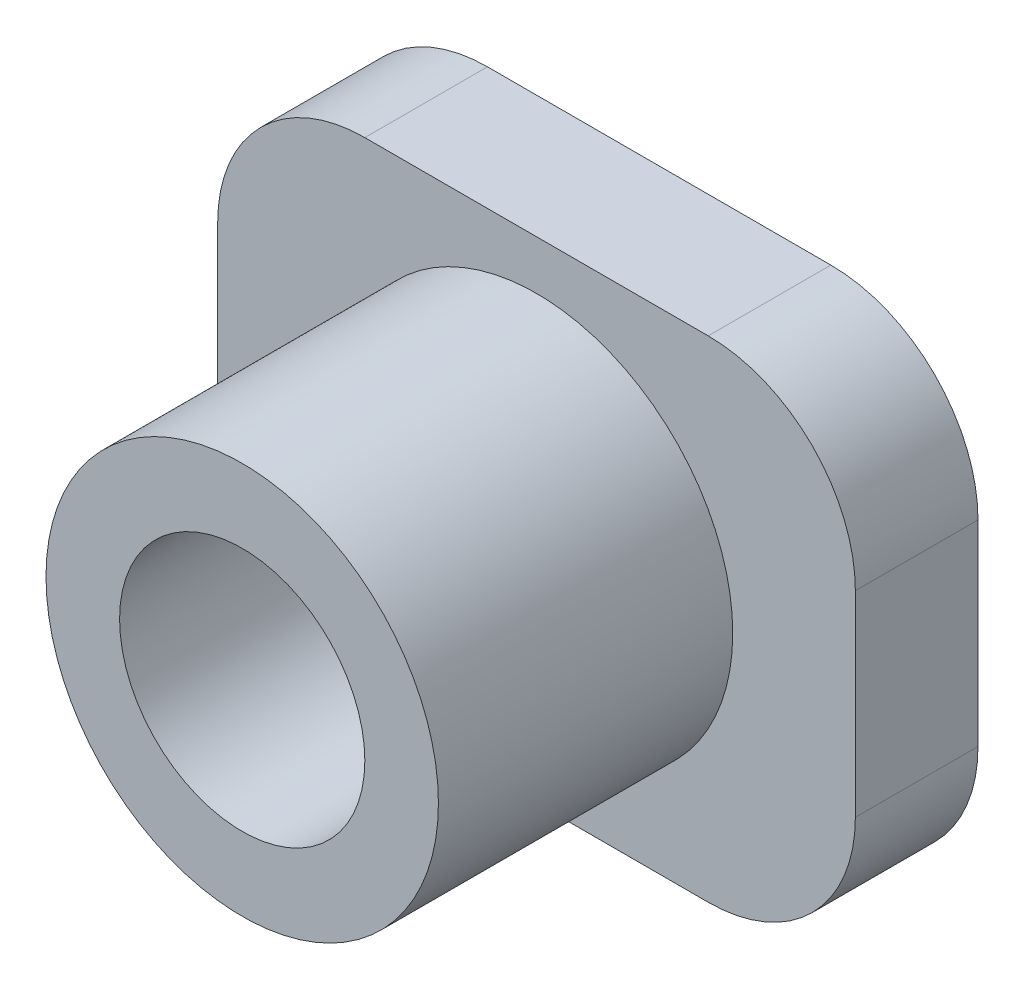
ISO-10303-21;
HEADER;
FILE_DESCRIPTION(('STEP AP214'),'2;1');
FILE_NAME('part.step','',(''),(''),'','','');
FILE_SCHEMA(('AUTOMOTIVE_DESIGN { 1 0 10303 214 1 1 1 1 }'));
ENDSEC;
DATA;
#1=APPLICATION_CONTEXT('core data for automotive mechanical design processes');
#2=APPLICATION_PROTOCOL_DEFINITION('international standard','automotive_design',2000,#1);
#3=PRODUCT_CONTEXT('',#1,'mechanical');
#4=PRODUCT('Part','Part','',(#3));
#5=PRODUCT_RELATED_PRODUCT_CATEGORY('part','',(#4));
#6=PRODUCT_DEFINITION_FORMATION('','',#4);
#7=PRODUCT_DEFINITION_CONTEXT('part definition',#1,'design');
#8=PRODUCT_DEFINITION('design','',#6,#7);
#9=PRODUCT_DEFINITION_SHAPE('','',#8);
#10=(LENGTH_UNIT() NAMED_UNIT(*) SI_UNIT(.MILLI.,.METRE.));
#11=(NAMED_UNIT(*) PLANE_ANGLE_UNIT() SI_UNIT($,.RADIAN.));
#12=(NAMED_UNIT(*) SI_UNIT($,.STERADIAN.) SOLID_ANGLE_UNIT());
#13=UNCERTAINTY_MEASURE_WITH_UNIT(LENGTH_MEASURE(1.E-05),#10,'distance_accuracy_value','');
#14=(GEOMETRIC_REPRESENTATION_CONTEXT(3) GLOBAL_UNCERTAINTY_ASSIGNED_CONTEXT((#13)) GLOBAL_UNIT_ASSIGNED_CONTEXT((#10,
#11,#12)) REPRESENTATION_CONTEXT('',''));
#15=CARTESIAN_POINT('',(0.,0.,0.));
#16=DIRECTION('',(0.,0.,1.));
#17=DIRECTION('',(1.,0.,0.));
#18=AXIS2_PLACEMENT_3D('',#15,#16,#17);
#19=CARTESIAN_POINT('',(0.,0.,5.));
#20=DIRECTION('',(0.,0.,1.));
#21=DIRECTION('',(1.,0.,0.));
#22=AXIS2_PLACEMENT_3D('',#19,#20,#21);
#23=PLANE('',#22);
#24=DIRECTION('',(1.,0.,0.));
#25=VECTOR('',#24,1.);
#26=CARTESIAN_POINT('',(-13.,-10.,5.));
#27=LINE('',#26,#25);
#28=CARTESIAN_POINT('',(-7.,-10.,5.));
#29=VERTEX_POINT('',#28);
#30=CARTESIAN_POINT('',(7.,-10.,5.));
#31=VERTEX_POINT('',#30);
#32=EDGE_CURVE('E172',#29,#31,#27,.T.);
#33=ORIENTED_EDGE('',*,*,#32,.T.);
#34=CARTESIAN_POINT('',(7.,-4.,5.));
#35=DIRECTION('',(0.,0.,1.));
#36=DIRECTION('',(1.,0.,0.));
#37=AXIS2_PLACEMENT_3D('',#34,#35,#36);
#38=CIRCLE('',#37,6.);
#39=CARTESIAN_POINT('',(13.,-4.,5.));
#40=VERTEX_POINT('',#39);
#41=EDGE_CURVE('E155',#31,#40,#38,.T.);
#42=ORIENTED_EDGE('',*,*,#41,.T.);
#43=DIRECTION('',(0.,1.,0.));
#44=VECTOR('',#43,1.);
#45=CARTESIAN_POINT('',(13.,-10.,5.));
#46=LINE('',#45,#44);
#47=CARTESIAN_POINT('',(13.,4.,5.));
#48=VERTEX_POINT('',#47);
#49=EDGE_CURVE('E124',#40,#48,#46,.T.);
#50=ORIENTED_EDGE('',*,*,#49,.T.);
#51=CARTESIAN_POINT('',(7.,4.,5.));
#52=DIRECTION('',(0.,0.,1.));
#53=DIRECTION('',(1.,0.,0.));
#54=AXIS2_PLACEMENT_3D('',#51,#52,#53);
#55=CIRCLE('',#54,6.);
#56=CARTESIAN_POINT('',(7.,10.,5.));
#57=VERTEX_POINT('',#56);
#58=EDGE_CURVE('E153',#48,#57,#55,.T.);
#59=ORIENTED_EDGE('',*,*,#58,.T.);
#60=DIRECTION('',(-1.,0.,0.));
#61=VECTOR('',#60,1.);
#62=CARTESIAN_POINT('',(-13.,10.,5.));
#63=LINE('',#62,#61);
#64=CARTESIAN_POINT('',(-7.,10.,5.));
#65=VERTEX_POINT('',#64);
#66=EDGE_CURVE('E130',#57,#65,#63,.T.);
#67=ORIENTED_EDGE('',*,*,#66,.T.);
#68=CARTESIAN_POINT('',(-7.,4.,5.));
#69=DIRECTION('',(0.,0.,1.));
#70=DIRECTION('',(1.,0.,0.));
#71=AXIS2_PLACEMENT_3D('',#68,#69,#70);
#72=CIRCLE('',#71,6.);
#73=CARTESIAN_POINT('',(-13.,4.,5.));
#74=VERTEX_POINT('',#73);
#75=EDGE_CURVE('E59',#65,#74,#72,.T.);
#76=ORIENTED_EDGE('',*,*,#75,.T.);
#77=DIRECTION('',(0.,-1.,0.));
#78=VECTOR('',#77,1.);
#79=CARTESIAN_POINT('',(-13.,-10.,5.));
#80=LINE('',#79,#78);
#81=CARTESIAN_POINT('',(-13.,-4.,5.));
#82=VERTEX_POINT('',#81);
#83=EDGE_CURVE('E133',#74,#82,#80,.T.);
#84=ORIENTED_EDGE('',*,*,#83,.T.);
#85=CARTESIAN_POINT('',(-7.,-4.,5.));
#86=DIRECTION('',(0.,0.,1.));
#87=DIRECTION('',(1.,0.,0.));
#88=AXIS2_PLACEMENT_3D('',#85,#86,#87);
#89=CIRCLE('',#88,6.);
#90=EDGE_CURVE('E151',#82,#29,#89,.T.);
#91=ORIENTED_EDGE('',*,*,#90,.T.);
#92=EDGE_LOOP('',(#33,#42,#50,#59,#67,#76,#84,#91));
#93=FACE_BOUND('',#92,.T.);
#94=CARTESIAN_POINT('',(0.,0.,5.));
#95=DIRECTION('',(0.,0.,1.));
#96=DIRECTION('',(1.,0.,0.));
#97=AXIS2_PLACEMENT_3D('',#94,#95,#96);
#98=CIRCLE('',#97,8.);
#99=CARTESIAN_POINT('',(8.,0.,5.));
#100=VERTEX_POINT('',#99);
#101=EDGE_CURVE('E176',#100,#100,#98,.T.);
#102=ORIENTED_EDGE('',*,*,#101,.F.);
#103=EDGE_LOOP('',(#102));
#104=FACE_BOUND('',#103,.T.);
#105=ADVANCED_FACE('F39',(#93,#104),#23,.T.);
#106=CARTESIAN_POINT('',(-13.,10.,5.));
#107=DIRECTION('',(0.,-1.,0.));
#108=DIRECTION('',(0.,0.,-1.));
#109=AXIS2_PLACEMENT_3D('',#106,#107,#108);
#110=PLANE('',#109);
#111=ORIENTED_EDGE('',*,*,#66,.F.);
#112=DIRECTION('',(0.,0.,-1.));
#113=VECTOR('',#112,1.);
#114=CARTESIAN_POINT('',(7.,10.,5.));
#115=LINE('',#114,#113);
#116=CARTESIAN_POINT('',(7.,10.,0.));
#117=VERTEX_POINT('',#116);
#118=EDGE_CURVE('E159',#57,#117,#115,.T.);
#119=ORIENTED_EDGE('',*,*,#118,.T.);
#120=DIRECTION('',(-1.,0.,0.));
#121=VECTOR('',#120,1.);
#122=CARTESIAN_POINT('',(-13.,10.,0.));
#123=LINE('',#122,#121);
#124=CARTESIAN_POINT('',(-7.,10.,0.));
#125=VERTEX_POINT('',#124);
#126=EDGE_CURVE('E167',#117,#125,#123,.T.);
#127=ORIENTED_EDGE('',*,*,#126,.T.);
#128=DIRECTION('',(0.,0.,-1.));
#129=VECTOR('',#128,1.);
#130=CARTESIAN_POINT('',(-7.,10.,5.));
#131=LINE('',#130,#129);
#132=EDGE_CURVE('E157',#125,#65,#131,.F.);
#133=ORIENTED_EDGE('',*,*,#132,.T.);
#134=EDGE_LOOP('',(#111,#119,#127,#133));
#135=FACE_BOUND('',#134,.T.);
#136=ADVANCED_FACE('F202',(#135),#110,.F.);
#137=CARTESIAN_POINT('',(-13.,-10.,5.));
#138=DIRECTION('',(1.,0.,0.));
#139=DIRECTION('',(0.,0.,-1.));
#140=AXIS2_PLACEMENT_3D('',#137,#138,#139);
#141=PLANE('',#140);
#142=DIRECTION('',(0.,-1.,0.));
#143=VECTOR('',#142,1.);
#144=CARTESIAN_POINT('',(-13.,-10.,0.));
#145=LINE('',#144,#143);
#146=CARTESIAN_POINT('',(-13.,4.,0.));
#147=VERTEX_POINT('',#146);
#148=CARTESIAN_POINT('',(-13.,-4.,0.));
#149=VERTEX_POINT('',#148);
#150=EDGE_CURVE('E135',#147,#149,#145,.T.);
#151=ORIENTED_EDGE('',*,*,#150,.T.);
#152=DIRECTION('',(0.,0.,-1.));
#153=VECTOR('',#152,1.);
#154=CARTESIAN_POINT('',(-13.,-4.,5.));
#155=LINE('',#154,#153);
#156=EDGE_CURVE('E11',#149,#82,#155,.F.);
#157=ORIENTED_EDGE('',*,*,#156,.T.);
#158=ORIENTED_EDGE('',*,*,#83,.F.);
#159=DIRECTION('',(0.,0.,-1.));
#160=VECTOR('',#159,1.);
#161=CARTESIAN_POINT('',(-13.,4.,5.));
#162=LINE('',#161,#160);
#163=EDGE_CURVE('E47',#74,#147,#162,.T.);
#164=ORIENTED_EDGE('',*,*,#163,.T.);
#165=EDGE_LOOP('',(#151,#157,#158,#164));
#166=FACE_BOUND('',#165,.T.);
#167=ADVANCED_FACE('F164',(#166),#141,.F.);
#168=CARTESIAN_POINT('',(-13.,-10.,5.));
#169=DIRECTION('',(0.,1.,0.));
#170=DIRECTION('',(0.,0.,1.));
#171=AXIS2_PLACEMENT_3D('',#168,#169,#170);
#172=PLANE('',#171);
#173=DIRECTION('',(1.,0.,0.));
#174=VECTOR('',#173,1.);
#175=CARTESIAN_POINT('',(-13.,-10.,0.));
#176=LINE('',#175,#174);
#177=CARTESIAN_POINT('',(-7.,-10.,0.));
#178=VERTEX_POINT('',#177);
#179=CARTESIAN_POINT('',(7.,-10.,0.));
#180=VERTEX_POINT('',#179);
#181=EDGE_CURVE('E131',#178,#180,#176,.T.);
#182=ORIENTED_EDGE('',*,*,#181,.T.);
#183=DIRECTION('',(0.,0.,-1.));
#184=VECTOR('',#183,1.);
#185=CARTESIAN_POINT('',(7.,-10.,5.));
#186=LINE('',#185,#184);
#187=EDGE_CURVE('E109',#180,#31,#186,.F.);
#188=ORIENTED_EDGE('',*,*,#187,.T.);
#189=ORIENTED_EDGE('',*,*,#32,.F.);
#190=DIRECTION('',(0.,0.,-1.));
#191=VECTOR('',#190,1.);
#192=CARTESIAN_POINT('',(-7.,-10.,5.));
#193=LINE('',#192,#191);
#194=EDGE_CURVE('E114',#29,#178,#193,.T.);
#195=ORIENTED_EDGE('',*,*,#194,.T.);
#196=EDGE_LOOP('',(#182,#188,#189,#195));
#197=FACE_BOUND('',#196,.T.);
#198=ADVANCED_FACE('F260',(#197),#172,.F.);
#199=CARTESIAN_POINT('',(13.,-10.,5.));
#200=DIRECTION('',(-1.,0.,0.));
#201=DIRECTION('',(0.,0.,1.));
#202=AXIS2_PLACEMENT_3D('',#199,#200,#201);
#203=PLANE('',#202);
#204=ORIENTED_EDGE('',*,*,#49,.F.);
#205=DIRECTION('',(0.,0.,-1.));
#206=VECTOR('',#205,1.);
#207=CARTESIAN_POINT('',(13.,-4.,5.));
#208=LINE('',#207,#206);
#209=CARTESIAN_POINT('',(13.,-4.,0.));
#210=VERTEX_POINT('',#209);
#211=EDGE_CURVE('E108',#40,#210,#208,.T.);
#212=ORIENTED_EDGE('',*,*,#211,.T.);
#213=DIRECTION('',(0.,1.,0.));
#214=VECTOR('',#213,1.);
#215=CARTESIAN_POINT('',(13.,-10.,0.));
#216=LINE('',#215,#214);
#217=CARTESIAN_POINT('',(13.,4.,0.));
#218=VERTEX_POINT('',#217);
#219=EDGE_CURVE('E121',#210,#218,#216,.T.);
#220=ORIENTED_EDGE('',*,*,#219,.T.);
#221=DIRECTION('',(0.,0.,-1.));
#222=VECTOR('',#221,1.);
#223=CARTESIAN_POINT('',(13.,4.,5.));
#224=LINE('',#223,#222);
#225=EDGE_CURVE('E126',#218,#48,#224,.F.);
#226=ORIENTED_EDGE('',*,*,#225,.T.);
#227=EDGE_LOOP('',(#204,#212,#220,#226));
#228=FACE_BOUND('',#227,.T.);
#229=ADVANCED_FACE('F120',(#228),#203,.F.);
#230=CARTESIAN_POINT('',(0.,0.,0.));
#231=DIRECTION('',(0.,0.,1.));
#232=DIRECTION('',(1.,0.,0.));
#233=AXIS2_PLACEMENT_3D('',#230,#231,#232);
#234=PLANE('',#233);
#235=ORIENTED_EDGE('',*,*,#219,.F.);
#236=CARTESIAN_POINT('',(7.,-4.,0.));
#237=DIRECTION('',(0.,0.,1.));
#238=DIRECTION('',(1.,0.,0.));
#239=AXIS2_PLACEMENT_3D('',#236,#237,#238);
#240=CIRCLE('',#239,6.);
#241=EDGE_CURVE('E104',#210,#180,#240,.F.);
#242=ORIENTED_EDGE('',*,*,#241,.T.);
#243=ORIENTED_EDGE('',*,*,#181,.F.);
#244=CARTESIAN_POINT('',(-7.,-4.,0.));
#245=DIRECTION('',(0.,0.,1.));
#246=DIRECTION('',(1.,0.,0.));
#247=AXIS2_PLACEMENT_3D('',#244,#245,#246);
#248=CIRCLE('',#247,6.);
#249=EDGE_CURVE('E144',#178,#149,#248,.F.);
#250=ORIENTED_EDGE('',*,*,#249,.T.);
#251=ORIENTED_EDGE('',*,*,#150,.F.);
#252=CARTESIAN_POINT('',(-7.,4.,0.));
#253=DIRECTION('',(0.,0.,1.));
#254=DIRECTION('',(1.,0.,0.));
#255=AXIS2_PLACEMENT_3D('',#252,#253,#254);
#256=CIRCLE('',#255,6.);
#257=EDGE_CURVE('E125',#147,#125,#256,.F.);
#258=ORIENTED_EDGE('',*,*,#257,.T.);
#259=ORIENTED_EDGE('',*,*,#126,.F.);
#260=CARTESIAN_POINT('',(7.,4.,0.));
#261=DIRECTION('',(0.,0.,1.));
#262=DIRECTION('',(1.,0.,0.));
#263=AXIS2_PLACEMENT_3D('',#260,#261,#262);
#264=CIRCLE('',#263,6.);
#265=EDGE_CURVE('E115',#117,#218,#264,.F.);
#266=ORIENTED_EDGE('',*,*,#265,.T.);
#267=EDGE_LOOP('',(#235,#242,#243,#250,#251,#258,#259,#266));
#268=FACE_BOUND('',#267,.T.);
#269=ADVANCED_FACE('F128',(#268),#234,.F.);
#270=CARTESIAN_POINT('',(0.,0.,17.));
#271=DIRECTION('',(0.,0.,1.));
#272=DIRECTION('',(1.,0.,0.));
#273=AXIS2_PLACEMENT_3D('',#270,#271,#272);
#274=PLANE('',#273);
#275=CARTESIAN_POINT('',(0.,0.,17.));
#276=DIRECTION('',(0.,0.,1.));
#277=DIRECTION('',(1.,0.,0.));
#278=AXIS2_PLACEMENT_3D('',#275,#276,#277);
#279=CIRCLE('',#278,8.);
#280=CARTESIAN_POINT('',(8.,0.,17.));
#281=VERTEX_POINT('',#280);
#282=EDGE_CURVE('E168',#281,#281,#279,.T.);
#283=ORIENTED_EDGE('',*,*,#282,.T.);
#284=EDGE_LOOP('',(#283));
#285=FACE_BOUND('',#284,.T.);
#286=CARTESIAN_POINT('',(0.,0.,17.));
#287=DIRECTION('',(0.,0.,1.));
#288=DIRECTION('',(1.,0.,0.));
#289=AXIS2_PLACEMENT_3D('',#286,#287,#288);
#290=CIRCLE('',#289,5.);
#291=CARTESIAN_POINT('',(5.,0.,17.));
#292=VERTEX_POINT('',#291);
#293=EDGE_CURVE('E179',#292,#292,#290,.T.);
#294=ORIENTED_EDGE('',*,*,#293,.F.);
#295=EDGE_LOOP('',(#294));
#296=FACE_BOUND('',#295,.T.);
#297=ADVANCED_FACE('F188',(#285,#296),#274,.T.);
#298=CARTESIAN_POINT('',(0.,0.,17.));
#299=DIRECTION('',(0.,0.,-1.));
#300=DIRECTION('',(-1.,0.,0.));
#301=AXIS2_PLACEMENT_3D('',#298,#299,#300);
#302=CYLINDRICAL_SURFACE('',#301,8.);
#303=ORIENTED_EDGE('',*,*,#282,.F.);
#304=EDGE_LOOP('',(#303));
#305=FACE_BOUND('',#304,.T.);
#306=ORIENTED_EDGE('',*,*,#101,.T.);
#307=EDGE_LOOP('',(#306));
#308=FACE_BOUND('',#307,.T.);
#309=ADVANCED_FACE('F190',(#305,#308),#302,.T.);
#310=CARTESIAN_POINT('',(0.,0.,17.));
#311=DIRECTION('',(0.,0.,-1.));
#312=DIRECTION('',(-1.,0.,0.));
#313=AXIS2_PLACEMENT_3D('',#310,#311,#312);
#314=CYLINDRICAL_SURFACE('',#313,5.);
#315=ORIENTED_EDGE('',*,*,#293,.T.);
#316=EDGE_LOOP('',(#315));
#317=FACE_BOUND('',#316,.T.);
#318=CARTESIAN_POINT('',(0.,0.,5.));
#319=DIRECTION('',(0.,0.,1.));
#320=DIRECTION('',(1.,0.,0.));
#321=AXIS2_PLACEMENT_3D('',#318,#319,#320);
#322=CIRCLE('',#321,5.);
#323=CARTESIAN_POINT('',(5.,0.,5.));
#324=VERTEX_POINT('',#323);
#325=EDGE_CURVE('E139',#324,#324,#322,.F.);
#326=ORIENTED_EDGE('',*,*,#325,.T.);
#327=EDGE_LOOP('',(#326));
#328=FACE_BOUND('',#327,.T.);
#329=ADVANCED_FACE('F185',(#317,#328),#314,.F.);
#330=ORIENTED_EDGE('',*,*,#325,.F.);
#331=EDGE_LOOP('',(#330));
#332=FACE_BOUND('',#331,.T.);
#333=ADVANCED_FACE('F204',(#332),#23,.T.);
#334=CARTESIAN_POINT('',(7.,-4.,5.));
#335=DIRECTION('',(0.,0.,-1.));
#336=DIRECTION('',(-1.,0.,0.));
#337=AXIS2_PLACEMENT_3D('',#334,#335,#336);
#338=CYLINDRICAL_SURFACE('',#337,6.);
#339=ORIENTED_EDGE('',*,*,#41,.F.);
#340=ORIENTED_EDGE('',*,*,#187,.F.);
#341=ORIENTED_EDGE('',*,*,#241,.F.);
#342=ORIENTED_EDGE('',*,*,#211,.F.);
#343=EDGE_LOOP('',(#339,#340,#341,#342));
#344=FACE_BOUND('',#343,.T.);
#345=ADVANCED_FACE('F107',(#344),#338,.T.);
#346=CARTESIAN_POINT('',(7.,4.,5.));
#347=DIRECTION('',(0.,0.,-1.));
#348=DIRECTION('',(-1.,0.,0.));
#349=AXIS2_PLACEMENT_3D('',#346,#347,#348);
#350=CYLINDRICAL_SURFACE('',#349,6.);
#351=ORIENTED_EDGE('',*,*,#58,.F.);
#352=ORIENTED_EDGE('',*,*,#225,.F.);
#353=ORIENTED_EDGE('',*,*,#265,.F.);
#354=ORIENTED_EDGE('',*,*,#118,.F.);
#355=EDGE_LOOP('',(#351,#352,#353,#354));
#356=FACE_BOUND('',#355,.T.);
#357=ADVANCED_FACE('F217',(#356),#350,.T.);
#358=CARTESIAN_POINT('',(-7.,-4.,5.));
#359=DIRECTION('',(0.,0.,-1.));
#360=DIRECTION('',(-1.,0.,0.));
#361=AXIS2_PLACEMENT_3D('',#358,#359,#360);
#362=CYLINDRICAL_SURFACE('',#361,6.);
#363=ORIENTED_EDGE('',*,*,#90,.F.);
#364=ORIENTED_EDGE('',*,*,#156,.F.);
#365=ORIENTED_EDGE('',*,*,#249,.F.);
#366=ORIENTED_EDGE('',*,*,#194,.F.);
#367=EDGE_LOOP('',(#363,#364,#365,#366));
#368=FACE_BOUND('',#367,.T.);
#369=ADVANCED_FACE('F295',(#368),#362,.T.);
#370=CARTESIAN_POINT('',(-7.,4.,5.));
#371=DIRECTION('',(0.,0.,-1.));
#372=DIRECTION('',(-1.,0.,0.));
#373=AXIS2_PLACEMENT_3D('',#370,#371,#372);
#374=CYLINDRICAL_SURFACE('',#373,6.);
#375=ORIENTED_EDGE('',*,*,#75,.F.);
#376=ORIENTED_EDGE('',*,*,#132,.F.);
#377=ORIENTED_EDGE('',*,*,#257,.F.);
#378=ORIENTED_EDGE('',*,*,#163,.F.);
#379=EDGE_LOOP('',(#375,#376,#377,#378));
#380=FACE_BOUND('',#379,.T.);
#381=ADVANCED_FACE('F41',(#380),#374,.T.);
#382=CLOSED_SHELL('',(#105,#136,#167,#198,#229,#269,#297,#309,#329,#333,#345,#357,#369,#381));
#383=MANIFOLD_SOLID_BREP('B2',#382);
#384=ADVANCED_BREP_SHAPE_REPRESENTATION('',(#18,#383),#14);
#385=SHAPE_DEFINITION_REPRESENTATION(#9,#384);
ENDSEC;
END-ISO-10303-21;
